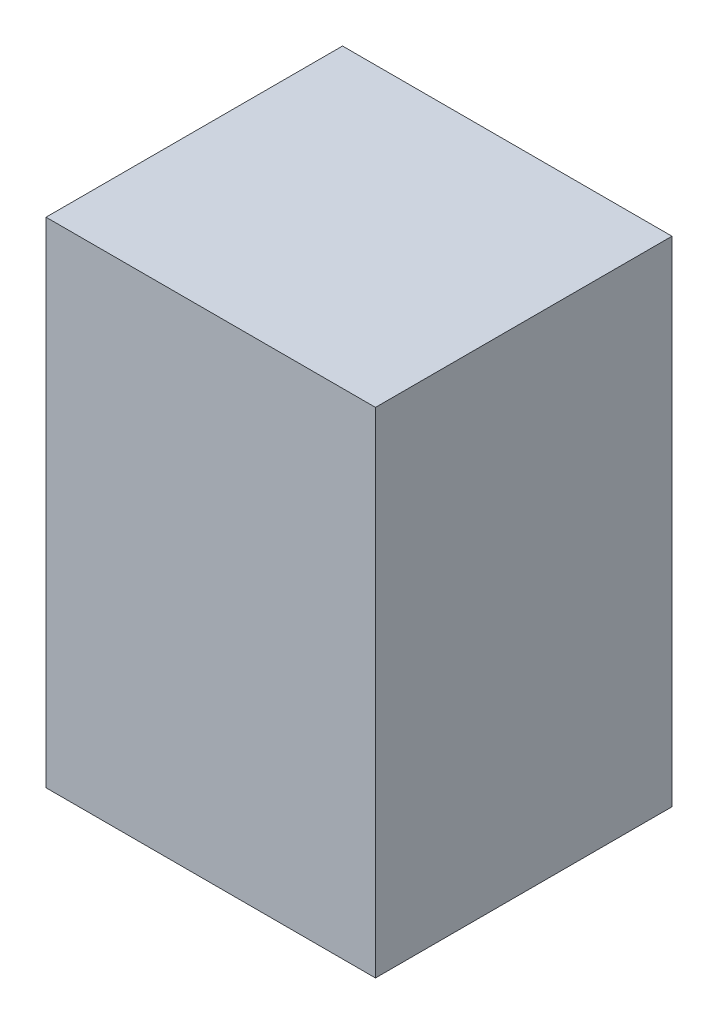
ISO-10303-21;
HEADER;
FILE_DESCRIPTION(('STEP AP214'),'2;1');
FILE_NAME('part.step','',(''),(''),'','','');
FILE_SCHEMA(('AUTOMOTIVE_DESIGN { 1 0 10303 214 1 1 1 1 }'));
ENDSEC;
DATA;
#1=APPLICATION_CONTEXT('core data for automotive mechanical design processes');
#2=APPLICATION_PROTOCOL_DEFINITION('international standard','automotive_design',2000,#1);
#3=PRODUCT_CONTEXT('',#1,'mechanical');
#4=PRODUCT('Part','Part','',(#3));
#5=PRODUCT_RELATED_PRODUCT_CATEGORY('part','',(#4));
#6=PRODUCT_DEFINITION_FORMATION('','',#4);
#7=PRODUCT_DEFINITION_CONTEXT('part definition',#1,'design');
#8=PRODUCT_DEFINITION('design','',#6,#7);
#9=PRODUCT_DEFINITION_SHAPE('','',#8);
#10=(LENGTH_UNIT() NAMED_UNIT(*) SI_UNIT(.MILLI.,.METRE.));
#11=(NAMED_UNIT(*) PLANE_ANGLE_UNIT() SI_UNIT($,.RADIAN.));
#12=(NAMED_UNIT(*) SI_UNIT($,.STERADIAN.) SOLID_ANGLE_UNIT());
#13=UNCERTAINTY_MEASURE_WITH_UNIT(LENGTH_MEASURE(1.E-05),#10,'distance_accuracy_value','');
#14=(GEOMETRIC_REPRESENTATION_CONTEXT(3) GLOBAL_UNCERTAINTY_ASSIGNED_CONTEXT((#13)) GLOBAL_UNIT_ASSIGNED_CONTEXT((#10,
#11,#12)) REPRESENTATION_CONTEXT('',''));
#15=CARTESIAN_POINT('',(0.,0.,0.));
#16=DIRECTION('',(0.,0.,1.));
#17=DIRECTION('',(1.,0.,0.));
#18=AXIS2_PLACEMENT_3D('',#15,#16,#17);
#19=CARTESIAN_POINT('',(100.,300.,-90.));
#20=DIRECTION('',(-1.,0.,0.));
#21=DIRECTION('',(0.,0.,1.));
#22=AXIS2_PLACEMENT_3D('',#19,#20,#21);
#23=PLANE('',#22);
#24=DIRECTION('',(0.,0.,-1.));
#25=VECTOR('',#24,1.);
#26=CARTESIAN_POINT('',(100.,0.,-90.));
#27=LINE('',#26,#25);
#28=CARTESIAN_POINT('',(100.,0.,90.));
#29=VERTEX_POINT('',#28);
#30=CARTESIAN_POINT('',(100.,0.,-90.));
#31=VERTEX_POINT('',#30);
#32=EDGE_CURVE('E109',#29,#31,#27,.T.);
#33=ORIENTED_EDGE('',*,*,#32,.T.);
#34=DIRECTION('',(0.,-1.,0.));
#35=VECTOR('',#34,1.);
#36=CARTESIAN_POINT('',(100.,300.,-90.));
#37=LINE('',#36,#35);
#38=CARTESIAN_POINT('',(100.,300.,-90.));
#39=VERTEX_POINT('',#38);
#40=EDGE_CURVE('E11',#39,#31,#37,.T.);
#41=ORIENTED_EDGE('',*,*,#40,.F.);
#42=DIRECTION('',(0.,0.,-1.));
#43=VECTOR('',#42,1.);
#44=CARTESIAN_POINT('',(100.,300.,-90.));
#45=LINE('',#44,#43);
#46=CARTESIAN_POINT('',(100.,300.,90.));
#47=VERTEX_POINT('',#46);
#48=EDGE_CURVE('E93',#47,#39,#45,.T.);
#49=ORIENTED_EDGE('',*,*,#48,.F.);
#50=DIRECTION('',(0.,-1.,0.));
#51=VECTOR('',#50,1.);
#52=CARTESIAN_POINT('',(100.,300.,90.));
#53=LINE('',#52,#51);
#54=EDGE_CURVE('E105',#47,#29,#53,.T.);
#55=ORIENTED_EDGE('',*,*,#54,.T.);
#56=EDGE_LOOP('',(#33,#41,#49,#55));
#57=FACE_BOUND('',#56,.T.);
#58=ADVANCED_FACE('F41',(#57),#23,.F.);
#59=CARTESIAN_POINT('',(-100.,300.,-90.));
#60=DIRECTION('',(0.,0.,1.));
#61=DIRECTION('',(1.,0.,0.));
#62=AXIS2_PLACEMENT_3D('',#59,#60,#61);
#63=PLANE('',#62);
#64=DIRECTION('',(-1.,0.,0.));
#65=VECTOR('',#64,1.);
#66=CARTESIAN_POINT('',(-100.,0.,-90.));
#67=LINE('',#66,#65);
#68=CARTESIAN_POINT('',(-100.,0.,-90.));
#69=VERTEX_POINT('',#68);
#70=EDGE_CURVE('E98',#31,#69,#67,.T.);
#71=ORIENTED_EDGE('',*,*,#70,.T.);
#72=DIRECTION('',(0.,-1.,0.));
#73=VECTOR('',#72,1.);
#74=CARTESIAN_POINT('',(-100.,300.,-90.));
#75=LINE('',#74,#73);
#76=CARTESIAN_POINT('',(-100.,300.,-90.));
#77=VERTEX_POINT('',#76);
#78=EDGE_CURVE('E50',#77,#69,#75,.T.);
#79=ORIENTED_EDGE('',*,*,#78,.F.);
#80=DIRECTION('',(-1.,0.,0.));
#81=VECTOR('',#80,1.);
#82=CARTESIAN_POINT('',(-100.,300.,-90.));
#83=LINE('',#82,#81);
#84=EDGE_CURVE('E88',#39,#77,#83,.T.);
#85=ORIENTED_EDGE('',*,*,#84,.F.);
#86=ORIENTED_EDGE('',*,*,#40,.T.);
#87=EDGE_LOOP('',(#71,#79,#85,#86));
#88=FACE_BOUND('',#87,.T.);
#89=ADVANCED_FACE('F97',(#88),#63,.F.);
#90=CARTESIAN_POINT('',(-100.,300.,-90.));
#91=DIRECTION('',(1.,0.,0.));
#92=DIRECTION('',(0.,0.,-1.));
#93=AXIS2_PLACEMENT_3D('',#90,#91,#92);
#94=PLANE('',#93);
#95=DIRECTION('',(0.,0.,1.));
#96=VECTOR('',#95,1.);
#97=CARTESIAN_POINT('',(-100.,0.,-90.));
#98=LINE('',#97,#96);
#99=CARTESIAN_POINT('',(-100.,0.,90.));
#100=VERTEX_POINT('',#99);
#101=EDGE_CURVE('E75',#69,#100,#98,.T.);
#102=ORIENTED_EDGE('',*,*,#101,.T.);
#103=DIRECTION('',(0.,-1.,0.));
#104=VECTOR('',#103,1.);
#105=CARTESIAN_POINT('',(-100.,300.,90.));
#106=LINE('',#105,#104);
#107=CARTESIAN_POINT('',(-100.,300.,90.));
#108=VERTEX_POINT('',#107);
#109=EDGE_CURVE('E100',#108,#100,#106,.T.);
#110=ORIENTED_EDGE('',*,*,#109,.F.);
#111=DIRECTION('',(0.,0.,1.));
#112=VECTOR('',#111,1.);
#113=CARTESIAN_POINT('',(-100.,300.,-90.));
#114=LINE('',#113,#112);
#115=EDGE_CURVE('E91',#77,#108,#114,.T.);
#116=ORIENTED_EDGE('',*,*,#115,.F.);
#117=ORIENTED_EDGE('',*,*,#78,.T.);
#118=EDGE_LOOP('',(#102,#110,#116,#117));
#119=FACE_BOUND('',#118,.T.);
#120=ADVANCED_FACE('F101',(#119),#94,.F.);
#121=CARTESIAN_POINT('',(-100.,300.,90.));
#122=DIRECTION('',(0.,0.,-1.));
#123=DIRECTION('',(-1.,0.,0.));
#124=AXIS2_PLACEMENT_3D('',#121,#122,#123);
#125=PLANE('',#124);
#126=DIRECTION('',(1.,0.,0.));
#127=VECTOR('',#126,1.);
#128=CARTESIAN_POINT('',(-100.,0.,90.));
#129=LINE('',#128,#127);
#130=EDGE_CURVE('E81',#100,#29,#129,.T.);
#131=ORIENTED_EDGE('',*,*,#130,.T.);
#132=ORIENTED_EDGE('',*,*,#54,.F.);
#133=DIRECTION('',(1.,0.,0.));
#134=VECTOR('',#133,1.);
#135=CARTESIAN_POINT('',(-100.,300.,90.));
#136=LINE('',#135,#134);
#137=EDGE_CURVE('E58',#108,#47,#136,.T.);
#138=ORIENTED_EDGE('',*,*,#137,.F.);
#139=ORIENTED_EDGE('',*,*,#109,.T.);
#140=EDGE_LOOP('',(#131,#132,#138,#139));
#141=FACE_BOUND('',#140,.T.);
#142=ADVANCED_FACE('F122',(#141),#125,.F.);
#143=CARTESIAN_POINT('',(0.,300.,0.));
#144=DIRECTION('',(0.,1.,0.));
#145=DIRECTION('',(0.,0.,1.));
#146=AXIS2_PLACEMENT_3D('',#143,#144,#145);
#147=PLANE('',#146);
#148=ORIENTED_EDGE('',*,*,#48,.T.);
#149=ORIENTED_EDGE('',*,*,#84,.T.);
#150=ORIENTED_EDGE('',*,*,#115,.T.);
#151=ORIENTED_EDGE('',*,*,#137,.T.);
#152=EDGE_LOOP('',(#148,#149,#150,#151));
#153=FACE_BOUND('',#152,.T.);
#154=ADVANCED_FACE('F89',(#153),#147,.T.);
#155=CARTESIAN_POINT('',(0.,0.,0.));
#156=DIRECTION('',(0.,1.,0.));
#157=DIRECTION('',(0.,0.,1.));
#158=AXIS2_PLACEMENT_3D('',#155,#156,#157);
#159=PLANE('',#158);
#160=ORIENTED_EDGE('',*,*,#32,.F.);
#161=ORIENTED_EDGE('',*,*,#130,.F.);
#162=ORIENTED_EDGE('',*,*,#101,.F.);
#163=ORIENTED_EDGE('',*,*,#70,.F.);
#164=EDGE_LOOP('',(#160,#161,#162,#163));
#165=FACE_BOUND('',#164,.T.);
#166=ADVANCED_FACE('F125',(#165),#159,.F.);
#167=CLOSED_SHELL('',(#58,#89,#120,#142,#154,#166));
#168=MANIFOLD_SOLID_BREP('B2',#167);
#169=ADVANCED_BREP_SHAPE_REPRESENTATION('',(#18,#168),#14);
#170=SHAPE_DEFINITION_REPRESENTATION(#9,#169);
ENDSEC;
END-ISO-10303-21;
